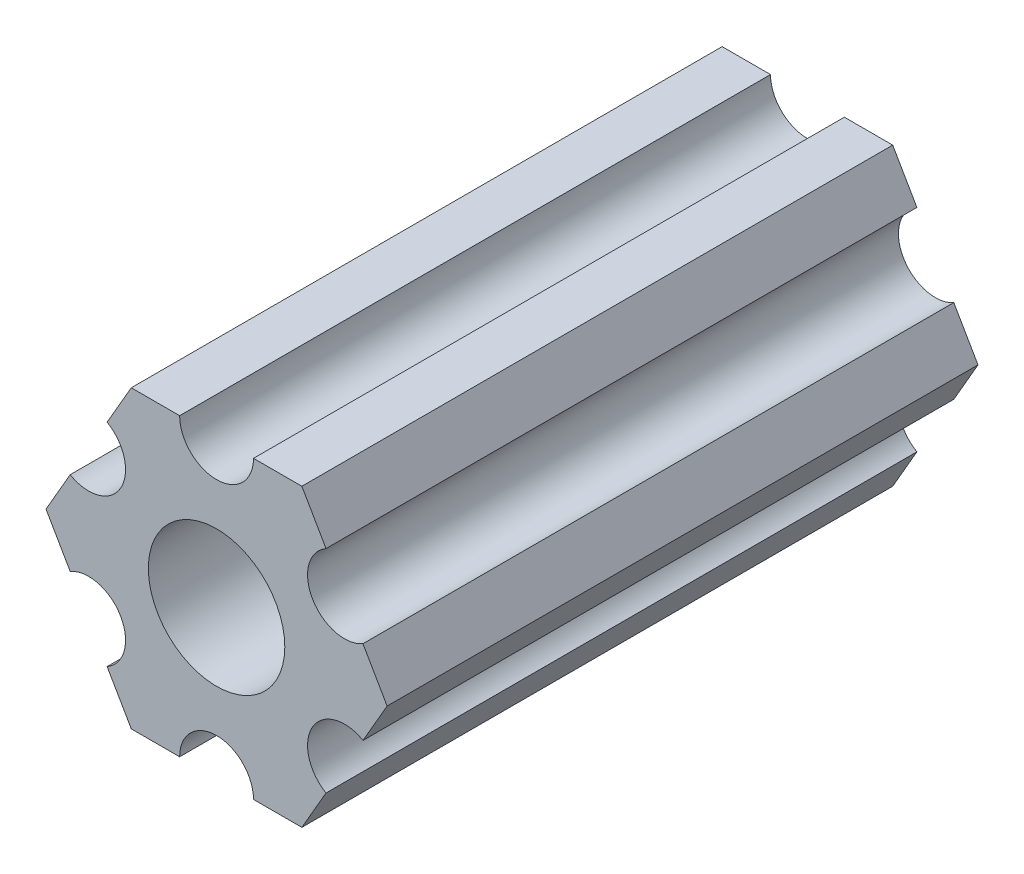
ISO-10303-21;
HEADER;
FILE_DESCRIPTION(('STEP AP214'),'2;1');
FILE_NAME('part.step','',(''),(''),'','','');
FILE_SCHEMA(('AUTOMOTIVE_DESIGN { 1 0 10303 214 1 1 1 1 }'));
ENDSEC;
DATA;
#1=APPLICATION_CONTEXT('core data for automotive mechanical design processes');
#2=APPLICATION_PROTOCOL_DEFINITION('international standard','automotive_design',2000,#1);
#3=PRODUCT_CONTEXT('',#1,'mechanical');
#4=PRODUCT('Part','Part','',(#3));
#5=PRODUCT_RELATED_PRODUCT_CATEGORY('part','',(#4));
#6=PRODUCT_DEFINITION_FORMATION('','',#4);
#7=PRODUCT_DEFINITION_CONTEXT('part definition',#1,'design');
#8=PRODUCT_DEFINITION('design','',#6,#7);
#9=PRODUCT_DEFINITION_SHAPE('','',#8);
#10=(LENGTH_UNIT() NAMED_UNIT(*) SI_UNIT(.MILLI.,.METRE.));
#11=(NAMED_UNIT(*) PLANE_ANGLE_UNIT() SI_UNIT($,.RADIAN.));
#12=(NAMED_UNIT(*) SI_UNIT($,.STERADIAN.) SOLID_ANGLE_UNIT());
#13=UNCERTAINTY_MEASURE_WITH_UNIT(LENGTH_MEASURE(1.E-05),#10,'distance_accuracy_value','');
#14=(GEOMETRIC_REPRESENTATION_CONTEXT(3) GLOBAL_UNCERTAINTY_ASSIGNED_CONTEXT((#13)) GLOBAL_UNIT_ASSIGNED_CONTEXT((#10,
#11,#12)) REPRESENTATION_CONTEXT('',''));
#15=CARTESIAN_POINT('',(0.,0.,0.));
#16=DIRECTION('',(0.,0.,1.));
#17=DIRECTION('',(1.,0.,0.));
#18=AXIS2_PLACEMENT_3D('',#15,#16,#17);
#19=CARTESIAN_POINT('',(5.49926150638083,-3.17499966684068,-25.4));
#20=DIRECTION('',(0.,0.,1.));
#21=DIRECTION('',(1.,0.,0.));
#22=AXIS2_PLACEMENT_3D('',#19,#20,#21);
#23=PLANE('',#22);
#24=CARTESIAN_POINT('',(5.49926150638083,-3.17499966684068,-25.4));
#25=DIRECTION('',(0.,0.,1.));
#26=DIRECTION('',(1.,0.,0.));
#27=AXIS2_PLACEMENT_3D('',#24,#25,#26);
#28=CIRCLE('',#27,1.58750000000001);
#29=CARTESIAN_POINT('',(6.29301142309098,-1.80018429024546,-25.4));
#30=VERTEX_POINT('',#29);
#31=CARTESIAN_POINT('',(4.70551158967068,-4.54981504343589,-25.4));
#32=VERTEX_POINT('',#31);
#33=EDGE_CURVE('E227',#30,#32,#28,.T.);
#34=ORIENTED_EDGE('',*,*,#33,.T.);
#35=DIRECTION('',(-0.499999947533953,-0.866025434075723,0.));
#36=VECTOR('',#35,1.);
#37=CARTESIAN_POINT('',(4.70551158967068,-4.54981504343589,-25.4));
#38=LINE('',#37,#36);
#39=CARTESIAN_POINT('',(3.66617452134693,-6.34999990382519,-25.4));
#40=VERTEX_POINT('',#39);
#41=EDGE_CURVE('E125',#32,#40,#38,.T.);
#42=ORIENTED_EDGE('',*,*,#41,.T.);
#43=DIRECTION('',(-1.,0.,0.));
#44=VECTOR('',#43,1.);
#45=CARTESIAN_POINT('',(3.66617452134693,-6.34999990382519,-25.4));
#46=LINE('',#45,#44);
#47=CARTESIAN_POINT('',(1.58750038469926,-6.34999990382518,-25.4));
#48=VERTEX_POINT('',#47);
#49=EDGE_CURVE('E272',#40,#48,#46,.T.);
#50=ORIENTED_EDGE('',*,*,#49,.T.);
#51=CARTESIAN_POINT('',(3.8469926204343E-07,-6.34999990382519,-25.4));
#52=DIRECTION('',(0.,0.,1.));
#53=DIRECTION('',(1.,0.,0.));
#54=AXIS2_PLACEMENT_3D('',#51,#52,#53);
#55=CIRCLE('',#54,1.5875);
#56=CARTESIAN_POINT('',(-1.58749961530074,-6.34999990382519,-25.4));
#57=VERTEX_POINT('',#56);
#58=EDGE_CURVE('E291',#48,#57,#55,.T.);
#59=ORIENTED_EDGE('',*,*,#58,.T.);
#60=DIRECTION('',(-1.,0.,0.));
#61=VECTOR('',#60,1.);
#62=CARTESIAN_POINT('',(-1.58749961530074,-6.34999990382519,-25.4));
#63=LINE('',#62,#61);
#64=CARTESIAN_POINT('',(-3.66617382465481,-6.34999990382519,-25.4));
#65=VERTEX_POINT('',#64);
#66=EDGE_CURVE('E288',#57,#65,#63,.T.);
#67=ORIENTED_EDGE('',*,*,#66,.T.);
#68=DIRECTION('',(-0.500000006198653,0.866025400205644,0.));
#69=VECTOR('',#68,1.);
#70=CARTESIAN_POINT('',(-3.66617382465481,-6.34999990382519,-25.4));
#71=LINE('',#70,#69);
#72=CARTESIAN_POINT('',(-4.70551094221689,-4.54981523977206,-25.4));
#73=VERTEX_POINT('',#72);
#74=EDGE_CURVE('E290',#65,#73,#71,.T.);
#75=ORIENTED_EDGE('',*,*,#74,.T.);
#76=CARTESIAN_POINT('',(-5.49926095205725,-3.1749999169456,-25.4));
#77=DIRECTION('',(0.,0.,1.));
#78=DIRECTION('',(1.,0.,0.));
#79=AXIS2_PLACEMENT_3D('',#76,#77,#78);
#80=CIRCLE('',#79,1.5875);
#81=CARTESIAN_POINT('',(-6.29301096189761,-1.80018459411914,-25.4));
#82=VERTEX_POINT('',#81);
#83=EDGE_CURVE('E293',#73,#82,#80,.T.);
#84=ORIENTED_EDGE('',*,*,#83,.T.);
#85=DIRECTION('',(-0.500000006198653,0.866025400205645,0.));
#86=VECTOR('',#85,1.);
#87=CARTESIAN_POINT('',(-6.29301096189761,-1.80018459411914,-25.4));
#88=LINE('',#87,#86);
#89=CARTESIAN_POINT('',(-7.33234807945963,6.99338729030344E-08,-25.4));
#90=VERTEX_POINT('',#89);
#91=EDGE_CURVE('E299',#82,#90,#88,.T.);
#92=ORIENTED_EDGE('',*,*,#91,.T.);
#93=DIRECTION('',(0.499999924400249,0.866025447431971,0.));
#94=VECTOR('',#93,1.);
#95=CARTESIAN_POINT('',(-7.33234807945963,6.99338729030344E-08,-25.4));
#96=LINE('',#95,#94);
#97=CARTESIAN_POINT('',(-6.29301121674195,1.80018468525613,-25.4));
#98=VERTEX_POINT('',#97);
#99=EDGE_CURVE('E301',#90,#98,#96,.T.);
#100=ORIENTED_EDGE('',*,*,#99,.T.);
#101=CARTESIAN_POINT('',(-5.49926133675655,3.17500008305439,-25.4));
#102=DIRECTION('',(0.,0.,1.));
#103=DIRECTION('',(1.,0.,0.));
#104=AXIS2_PLACEMENT_3D('',#101,#102,#103);
#105=CIRCLE('',#104,1.5875);
#106=CARTESIAN_POINT('',(-4.70551145677116,4.54981548085265,-25.4));
#107=VERTEX_POINT('',#106);
#108=EDGE_CURVE('E303',#98,#107,#105,.T.);
#109=ORIENTED_EDGE('',*,*,#108,.T.);
#110=DIRECTION('',(0.499999924400249,0.866025447431971,0.));
#111=VECTOR('',#110,1.);
#112=CARTESIAN_POINT('',(-4.70551145677116,4.54981548085265,-25.4));
#113=LINE('',#112,#111);
#114=CARTESIAN_POINT('',(-3.66617452134701,6.35000022210623,-25.4));
#115=VERTEX_POINT('',#114);
#116=EDGE_CURVE('E305',#107,#115,#113,.T.);
#117=ORIENTED_EDGE('',*,*,#116,.T.);
#118=DIRECTION('',(1.,0.,0.));
#119=VECTOR('',#118,1.);
#120=CARTESIAN_POINT('',(-3.66617452134701,6.35000022210623,-25.4));
#121=LINE('',#120,#119);
#122=CARTESIAN_POINT('',(-1.58750038469935,6.35000022210623,-25.4));
#123=VERTEX_POINT('',#122);
#124=EDGE_CURVE('E307',#115,#123,#121,.T.);
#125=ORIENTED_EDGE('',*,*,#124,.T.);
#126=CARTESIAN_POINT('',(-3.84699344941095E-07,6.35000022210623,-25.4));
#127=DIRECTION('',(0.,0.,1.));
#128=DIRECTION('',(1.,0.,0.));
#129=AXIS2_PLACEMENT_3D('',#126,#127,#128);
#130=CIRCLE('',#129,1.5875);
#131=CARTESIAN_POINT('',(1.58749961530066,6.35000022210623,-25.4));
#132=VERTEX_POINT('',#131);
#133=EDGE_CURVE('E309',#123,#132,#130,.T.);
#134=ORIENTED_EDGE('',*,*,#133,.T.);
#135=DIRECTION('',(1.,0.,0.));
#136=VECTOR('',#135,1.);
#137=CARTESIAN_POINT('',(1.58749961530066,6.35000022210623,-25.4));
#138=LINE('',#137,#136);
#139=CARTESIAN_POINT('',(3.66617382465472,6.35000022210622,-25.4));
#140=VERTEX_POINT('',#139);
#141=EDGE_CURVE('E311',#132,#140,#138,.T.);
#142=ORIENTED_EDGE('',*,*,#141,.T.);
#143=DIRECTION('',(0.500000052466056,-0.866025373493145,0.));
#144=VECTOR('',#143,1.);
#145=CARTESIAN_POINT('',(3.66617382465472,6.35000022210622,-25.4));
#146=LINE('',#145,#144);
#147=CARTESIAN_POINT('',(4.70551103839166,4.54981561357968,-25.4));
#148=VERTEX_POINT('',#147);
#149=EDGE_CURVE('E174',#140,#148,#146,.T.);
#150=ORIENTED_EDGE('',*,*,#149,.T.);
#151=CARTESIAN_POINT('',(5.49926112168152,3.17500033315931,-25.4));
#152=DIRECTION('',(0.,0.,1.));
#153=DIRECTION('',(1.,0.,0.));
#154=AXIS2_PLACEMENT_3D('',#151,#152,#153);
#155=CIRCLE('',#154,1.5875);
#156=CARTESIAN_POINT('',(6.29301120497139,1.80018505273895,-25.4));
#157=VERTEX_POINT('',#156);
#158=EDGE_CURVE('E168',#148,#157,#155,.T.);
#159=ORIENTED_EDGE('',*,*,#158,.T.);
#160=DIRECTION('',(0.500000052466056,-0.866025373493145,0.));
#161=VECTOR('',#160,1.);
#162=CARTESIAN_POINT('',(6.29301120497139,1.80018505273895,-25.4));
#163=LINE('',#162,#161);
#164=CARTESIAN_POINT('',(7.33234841870826,4.44212518856872E-07,-25.4));
#165=VERTEX_POINT('',#164);
#166=EDGE_CURVE('E172',#157,#165,#163,.T.);
#167=ORIENTED_EDGE('',*,*,#166,.T.);
#168=DIRECTION('',(-0.499999947533953,-0.866025434075723,0.));
#169=VECTOR('',#168,1.);
#170=CARTESIAN_POINT('',(7.33234841870826,4.44212518856872E-07,-25.4));
#171=LINE('',#170,#169);
#172=EDGE_CURVE('E52',#165,#30,#171,.T.);
#173=ORIENTED_EDGE('',*,*,#172,.T.);
#174=EDGE_LOOP('',(#34,#42,#50,#59,#67,#75,#84,#92,#100,#109,#117,#125,#134,#142,#150,#159,#167,#173));
#175=FACE_BOUND('',#174,.T.);
#176=CARTESIAN_POINT('',(0.,0.,-25.4));
#177=DIRECTION('',(0.,0.,-1.));
#178=DIRECTION('',(1.,0.,0.));
#179=AXIS2_PLACEMENT_3D('',#176,#177,#178);
#180=CIRCLE('',#179,2.9337);
#181=CARTESIAN_POINT('',(2.9337,0.,-25.4));
#182=VERTEX_POINT('',#181);
#183=EDGE_CURVE('E196',#182,#182,#180,.T.);
#184=ORIENTED_EDGE('',*,*,#183,.F.);
#185=EDGE_LOOP('',(#184));
#186=FACE_BOUND('',#185,.T.);
#187=ADVANCED_FACE('F35',(#175,#186),#23,.F.);
#188=CARTESIAN_POINT('',(5.49926150638083,-3.17499966684068,0.));
#189=DIRECTION('',(0.,0.,1.));
#190=DIRECTION('',(1.,0.,0.));
#191=AXIS2_PLACEMENT_3D('',#188,#189,#190);
#192=PLANE('',#191);
#193=CARTESIAN_POINT('',(5.49926150638083,-3.17499966684068,0.));
#194=DIRECTION('',(0.,0.,1.));
#195=DIRECTION('',(1.,0.,0.));
#196=AXIS2_PLACEMENT_3D('',#193,#194,#195);
#197=CIRCLE('',#196,1.58750000000001);
#198=CARTESIAN_POINT('',(6.29301142309098,-1.80018429024546,0.));
#199=VERTEX_POINT('',#198);
#200=CARTESIAN_POINT('',(4.70551158967068,-4.54981504343589,0.));
#201=VERTEX_POINT('',#200);
#202=EDGE_CURVE('E192',#199,#201,#197,.T.);
#203=ORIENTED_EDGE('',*,*,#202,.F.);
#204=DIRECTION('',(-0.499999947533953,-0.866025434075723,0.));
#205=VECTOR('',#204,1.);
#206=CARTESIAN_POINT('',(7.33234841870826,4.44212518856872E-07,0.));
#207=LINE('',#206,#205);
#208=CARTESIAN_POINT('',(7.33234841870826,4.44212518856872E-07,0.));
#209=VERTEX_POINT('',#208);
#210=EDGE_CURVE('E117',#209,#199,#207,.T.);
#211=ORIENTED_EDGE('',*,*,#210,.F.);
#212=DIRECTION('',(0.500000052466056,-0.866025373493145,0.));
#213=VECTOR('',#212,1.);
#214=CARTESIAN_POINT('',(6.29301120497139,1.80018505273895,0.));
#215=LINE('',#214,#213);
#216=CARTESIAN_POINT('',(6.29301120497139,1.80018505273895,0.));
#217=VERTEX_POINT('',#216);
#218=EDGE_CURVE('E111',#217,#209,#215,.T.);
#219=ORIENTED_EDGE('',*,*,#218,.F.);
#220=CARTESIAN_POINT('',(5.49926112168152,3.17500033315931,0.));
#221=DIRECTION('',(0.,0.,1.));
#222=DIRECTION('',(1.,0.,0.));
#223=AXIS2_PLACEMENT_3D('',#220,#221,#222);
#224=CIRCLE('',#223,1.5875);
#225=CARTESIAN_POINT('',(4.70551103839166,4.54981561357968,0.));
#226=VERTEX_POINT('',#225);
#227=EDGE_CURVE('E182',#226,#217,#224,.T.);
#228=ORIENTED_EDGE('',*,*,#227,.F.);
#229=DIRECTION('',(0.500000052466056,-0.866025373493145,0.));
#230=VECTOR('',#229,1.);
#231=CARTESIAN_POINT('',(3.66617382465472,6.35000022210622,0.));
#232=LINE('',#231,#230);
#233=CARTESIAN_POINT('',(3.66617382465472,6.35000022210622,0.));
#234=VERTEX_POINT('',#233);
#235=EDGE_CURVE('E222',#234,#226,#232,.T.);
#236=ORIENTED_EDGE('',*,*,#235,.F.);
#237=DIRECTION('',(1.,0.,0.));
#238=VECTOR('',#237,1.);
#239=CARTESIAN_POINT('',(1.58749961530066,6.35000022210623,0.));
#240=LINE('',#239,#238);
#241=CARTESIAN_POINT('',(1.58749961530066,6.35000022210623,0.));
#242=VERTEX_POINT('',#241);
#243=EDGE_CURVE('E220',#242,#234,#240,.T.);
#244=ORIENTED_EDGE('',*,*,#243,.F.);
#245=CARTESIAN_POINT('',(-3.84699344941095E-07,6.35000022210623,0.));
#246=DIRECTION('',(0.,0.,1.));
#247=DIRECTION('',(1.,0.,0.));
#248=AXIS2_PLACEMENT_3D('',#245,#246,#247);
#249=CIRCLE('',#248,1.5875);
#250=CARTESIAN_POINT('',(-1.58750038469935,6.35000022210623,0.));
#251=VERTEX_POINT('',#250);
#252=EDGE_CURVE('E218',#251,#242,#249,.T.);
#253=ORIENTED_EDGE('',*,*,#252,.F.);
#254=DIRECTION('',(1.,0.,0.));
#255=VECTOR('',#254,1.);
#256=CARTESIAN_POINT('',(-3.66617452134701,6.35000022210623,0.));
#257=LINE('',#256,#255);
#258=CARTESIAN_POINT('',(-3.66617452134701,6.35000022210623,0.));
#259=VERTEX_POINT('',#258);
#260=EDGE_CURVE('E216',#259,#251,#257,.T.);
#261=ORIENTED_EDGE('',*,*,#260,.F.);
#262=DIRECTION('',(0.499999924400249,0.866025447431971,0.));
#263=VECTOR('',#262,1.);
#264=CARTESIAN_POINT('',(-4.70551145677116,4.54981548085265,0.));
#265=LINE('',#264,#263);
#266=CARTESIAN_POINT('',(-4.70551145677116,4.54981548085265,0.));
#267=VERTEX_POINT('',#266);
#268=EDGE_CURVE('E214',#267,#259,#265,.T.);
#269=ORIENTED_EDGE('',*,*,#268,.F.);
#270=CARTESIAN_POINT('',(-5.49926133675655,3.17500008305439,0.));
#271=DIRECTION('',(0.,0.,1.));
#272=DIRECTION('',(1.,0.,0.));
#273=AXIS2_PLACEMENT_3D('',#270,#271,#272);
#274=CIRCLE('',#273,1.5875);
#275=CARTESIAN_POINT('',(-6.29301121674195,1.80018468525613,0.));
#276=VERTEX_POINT('',#275);
#277=EDGE_CURVE('E212',#276,#267,#274,.T.);
#278=ORIENTED_EDGE('',*,*,#277,.F.);
#279=DIRECTION('',(0.499999924400249,0.866025447431971,0.));
#280=VECTOR('',#279,1.);
#281=CARTESIAN_POINT('',(-7.33234807945963,6.99338729030344E-08,0.));
#282=LINE('',#281,#280);
#283=CARTESIAN_POINT('',(-7.33234807945963,6.99338729030344E-08,0.));
#284=VERTEX_POINT('',#283);
#285=EDGE_CURVE('E210',#284,#276,#282,.T.);
#286=ORIENTED_EDGE('',*,*,#285,.F.);
#287=DIRECTION('',(-0.500000006198653,0.866025400205645,0.));
#288=VECTOR('',#287,1.);
#289=CARTESIAN_POINT('',(-6.29301096189761,-1.80018459411914,0.));
#290=LINE('',#289,#288);
#291=CARTESIAN_POINT('',(-6.29301096189761,-1.80018459411914,0.));
#292=VERTEX_POINT('',#291);
#293=EDGE_CURVE('E208',#292,#284,#290,.T.);
#294=ORIENTED_EDGE('',*,*,#293,.F.);
#295=CARTESIAN_POINT('',(-5.49926095205725,-3.1749999169456,0.));
#296=DIRECTION('',(0.,0.,1.));
#297=DIRECTION('',(1.,0.,0.));
#298=AXIS2_PLACEMENT_3D('',#295,#296,#297);
#299=CIRCLE('',#298,1.5875);
#300=CARTESIAN_POINT('',(-4.70551094221689,-4.54981523977206,0.));
#301=VERTEX_POINT('',#300);
#302=EDGE_CURVE('E206',#301,#292,#299,.T.);
#303=ORIENTED_EDGE('',*,*,#302,.F.);
#304=DIRECTION('',(-0.500000006198653,0.866025400205644,0.));
#305=VECTOR('',#304,1.);
#306=CARTESIAN_POINT('',(-3.66617382465481,-6.34999990382519,0.));
#307=LINE('',#306,#305);
#308=CARTESIAN_POINT('',(-3.66617382465481,-6.34999990382519,0.));
#309=VERTEX_POINT('',#308);
#310=EDGE_CURVE('E204',#309,#301,#307,.T.);
#311=ORIENTED_EDGE('',*,*,#310,.F.);
#312=DIRECTION('',(-1.,0.,0.));
#313=VECTOR('',#312,1.);
#314=CARTESIAN_POINT('',(-1.58749961530074,-6.34999990382519,0.));
#315=LINE('',#314,#313);
#316=CARTESIAN_POINT('',(-1.58749961530074,-6.34999990382519,0.));
#317=VERTEX_POINT('',#316);
#318=EDGE_CURVE('E202',#317,#309,#315,.T.);
#319=ORIENTED_EDGE('',*,*,#318,.F.);
#320=CARTESIAN_POINT('',(3.8469926204343E-07,-6.34999990382519,0.));
#321=DIRECTION('',(0.,0.,1.));
#322=DIRECTION('',(1.,0.,0.));
#323=AXIS2_PLACEMENT_3D('',#320,#321,#322);
#324=CIRCLE('',#323,1.5875);
#325=CARTESIAN_POINT('',(1.58750038469926,-6.34999990382518,0.));
#326=VERTEX_POINT('',#325);
#327=EDGE_CURVE('E200',#326,#317,#324,.T.);
#328=ORIENTED_EDGE('',*,*,#327,.F.);
#329=DIRECTION('',(-1.,0.,0.));
#330=VECTOR('',#329,1.);
#331=CARTESIAN_POINT('',(3.66617452134693,-6.34999990382519,0.));
#332=LINE('',#331,#330);
#333=CARTESIAN_POINT('',(3.66617452134693,-6.34999990382519,0.));
#334=VERTEX_POINT('',#333);
#335=EDGE_CURVE('E198',#334,#326,#332,.T.);
#336=ORIENTED_EDGE('',*,*,#335,.F.);
#337=DIRECTION('',(-0.499999947533953,-0.866025434075723,0.));
#338=VECTOR('',#337,1.);
#339=CARTESIAN_POINT('',(4.70551158967068,-4.54981504343589,0.));
#340=LINE('',#339,#338);
#341=EDGE_CURVE('E195',#201,#334,#340,.T.);
#342=ORIENTED_EDGE('',*,*,#341,.F.);
#343=EDGE_LOOP('',(#203,#211,#219,#228,#236,#244,#253,#261,#269,#278,#286,#294,#303,#311,#319,
#328,#336,#342));
#344=FACE_BOUND('',#343,.T.);
#345=CARTESIAN_POINT('',(0.,0.,0.));
#346=DIRECTION('',(0.,0.,-1.));
#347=DIRECTION('',(1.,0.,0.));
#348=AXIS2_PLACEMENT_3D('',#345,#346,#347);
#349=CIRCLE('',#348,2.9337);
#350=CARTESIAN_POINT('',(2.9337,0.,0.));
#351=VERTEX_POINT('',#350);
#352=EDGE_CURVE('E536',#351,#351,#349,.T.);
#353=ORIENTED_EDGE('',*,*,#352,.T.);
#354=EDGE_LOOP('',(#353));
#355=FACE_BOUND('',#354,.T.);
#356=ADVANCED_FACE('F276',(#344,#355),#192,.T.);
#357=CARTESIAN_POINT('',(5.49926150638083,-3.17499966684068,-25.4));
#358=DIRECTION('',(0.,0.,1.));
#359=DIRECTION('',(1.,0.,0.));
#360=AXIS2_PLACEMENT_3D('',#357,#358,#359);
#361=CYLINDRICAL_SURFACE('',#360,1.58750000000001);
#362=ORIENTED_EDGE('',*,*,#202,.T.);
#363=DIRECTION('',(0.,0.,1.));
#364=VECTOR('',#363,1.);
#365=CARTESIAN_POINT('',(4.70551158967068,-4.54981504343589,-25.4));
#366=LINE('',#365,#364);
#367=EDGE_CURVE('E11',#32,#201,#366,.T.);
#368=ORIENTED_EDGE('',*,*,#367,.F.);
#369=ORIENTED_EDGE('',*,*,#33,.F.);
#370=DIRECTION('',(0.,0.,1.));
#371=VECTOR('',#370,1.);
#372=CARTESIAN_POINT('',(6.29301142309098,-1.80018429024546,-25.4));
#373=LINE('',#372,#371);
#374=EDGE_CURVE('E188',#30,#199,#373,.T.);
#375=ORIENTED_EDGE('',*,*,#374,.T.);
#376=EDGE_LOOP('',(#362,#368,#369,#375));
#377=FACE_BOUND('',#376,.T.);
#378=ADVANCED_FACE('F37',(#377),#361,.F.);
#379=CARTESIAN_POINT('',(4.70551158967068,-4.54981504343589,-25.4));
#380=DIRECTION('',(-0.866025434075723,0.499999947533953,0.));
#381=DIRECTION('',(-0.499999947533953,-0.866025434075723,0.));
#382=AXIS2_PLACEMENT_3D('',#379,#380,#381);
#383=PLANE('',#382);
#384=ORIENTED_EDGE('',*,*,#341,.T.);
#385=DIRECTION('',(0.,0.,1.));
#386=VECTOR('',#385,1.);
#387=CARTESIAN_POINT('',(3.66617452134693,-6.34999990382519,-25.4));
#388=LINE('',#387,#386);
#389=EDGE_CURVE('E44',#40,#334,#388,.T.);
#390=ORIENTED_EDGE('',*,*,#389,.F.);
#391=ORIENTED_EDGE('',*,*,#41,.F.);
#392=ORIENTED_EDGE('',*,*,#367,.T.);
#393=EDGE_LOOP('',(#384,#390,#391,#392));
#394=FACE_BOUND('',#393,.T.);
#395=ADVANCED_FACE('F345',(#394),#383,.F.);
#396=CARTESIAN_POINT('',(3.66617452134693,-6.34999990382519,-25.4));
#397=DIRECTION('',(0.,1.,0.));
#398=DIRECTION('',(-1.,0.,0.));
#399=AXIS2_PLACEMENT_3D('',#396,#397,#398);
#400=PLANE('',#399);
#401=ORIENTED_EDGE('',*,*,#335,.T.);
#402=DIRECTION('',(0.,0.,1.));
#403=VECTOR('',#402,1.);
#404=CARTESIAN_POINT('',(1.58750038469926,-6.34999990382518,-25.4));
#405=LINE('',#404,#403);
#406=EDGE_CURVE('E264',#48,#326,#405,.T.);
#407=ORIENTED_EDGE('',*,*,#406,.F.);
#408=ORIENTED_EDGE('',*,*,#49,.F.);
#409=ORIENTED_EDGE('',*,*,#389,.T.);
#410=EDGE_LOOP('',(#401,#407,#408,#409));
#411=FACE_BOUND('',#410,.T.);
#412=ADVANCED_FACE('F270',(#411),#400,.F.);
#413=CARTESIAN_POINT('',(3.8469926204343E-07,-6.34999990382519,-25.4));
#414=DIRECTION('',(0.,0.,1.));
#415=DIRECTION('',(1.,0.,0.));
#416=AXIS2_PLACEMENT_3D('',#413,#414,#415);
#417=CYLINDRICAL_SURFACE('',#416,1.5875);
#418=ORIENTED_EDGE('',*,*,#327,.T.);
#419=DIRECTION('',(0.,0.,1.));
#420=VECTOR('',#419,1.);
#421=CARTESIAN_POINT('',(-1.58749961530074,-6.34999990382519,-25.4));
#422=LINE('',#421,#420);
#423=EDGE_CURVE('E261',#57,#317,#422,.T.);
#424=ORIENTED_EDGE('',*,*,#423,.F.);
#425=ORIENTED_EDGE('',*,*,#58,.F.);
#426=ORIENTED_EDGE('',*,*,#406,.T.);
#427=EDGE_LOOP('',(#418,#424,#425,#426));
#428=FACE_BOUND('',#427,.T.);
#429=ADVANCED_FACE('F282',(#428),#417,.F.);
#430=CARTESIAN_POINT('',(-1.58749961530074,-6.34999990382519,-25.4));
#431=DIRECTION('',(0.,1.,0.));
#432=DIRECTION('',(-1.,0.,0.));
#433=AXIS2_PLACEMENT_3D('',#430,#431,#432);
#434=PLANE('',#433);
#435=ORIENTED_EDGE('',*,*,#318,.T.);
#436=DIRECTION('',(0.,0.,1.));
#437=VECTOR('',#436,1.);
#438=CARTESIAN_POINT('',(-3.66617382465481,-6.34999990382519,-25.4));
#439=LINE('',#438,#437);
#440=EDGE_CURVE('E258',#65,#309,#439,.T.);
#441=ORIENTED_EDGE('',*,*,#440,.F.);
#442=ORIENTED_EDGE('',*,*,#66,.F.);
#443=ORIENTED_EDGE('',*,*,#423,.T.);
#444=EDGE_LOOP('',(#435,#441,#442,#443));
#445=FACE_BOUND('',#444,.T.);
#446=ADVANCED_FACE('F286',(#445),#434,.F.);
#447=CARTESIAN_POINT('',(-3.66617382465481,-6.34999990382519,-25.4));
#448=DIRECTION('',(0.866025400205644,0.500000006198653,0.));
#449=DIRECTION('',(-0.500000006198653,0.866025400205645,0.));
#450=AXIS2_PLACEMENT_3D('',#447,#448,#449);
#451=PLANE('',#450);
#452=ORIENTED_EDGE('',*,*,#310,.T.);
#453=DIRECTION('',(0.,0.,1.));
#454=VECTOR('',#453,1.);
#455=CARTESIAN_POINT('',(-4.70551094221689,-4.54981523977206,-25.4));
#456=LINE('',#455,#454);
#457=EDGE_CURVE('E255',#73,#301,#456,.T.);
#458=ORIENTED_EDGE('',*,*,#457,.F.);
#459=ORIENTED_EDGE('',*,*,#74,.F.);
#460=ORIENTED_EDGE('',*,*,#440,.T.);
#461=EDGE_LOOP('',(#452,#458,#459,#460));
#462=FACE_BOUND('',#461,.T.);
#463=ADVANCED_FACE('F358',(#462),#451,.F.);
#464=CARTESIAN_POINT('',(-5.49926095205725,-3.1749999169456,-25.4));
#465=DIRECTION('',(0.,0.,1.));
#466=DIRECTION('',(1.,0.,0.));
#467=AXIS2_PLACEMENT_3D('',#464,#465,#466);
#468=CYLINDRICAL_SURFACE('',#467,1.5875);
#469=ORIENTED_EDGE('',*,*,#302,.T.);
#470=DIRECTION('',(0.,0.,1.));
#471=VECTOR('',#470,1.);
#472=CARTESIAN_POINT('',(-6.29301096189761,-1.80018459411914,-25.4));
#473=LINE('',#472,#471);
#474=EDGE_CURVE('E252',#82,#292,#473,.T.);
#475=ORIENTED_EDGE('',*,*,#474,.F.);
#476=ORIENTED_EDGE('',*,*,#83,.F.);
#477=ORIENTED_EDGE('',*,*,#457,.T.);
#478=EDGE_LOOP('',(#469,#475,#476,#477));
#479=FACE_BOUND('',#478,.T.);
#480=ADVANCED_FACE('F361',(#479),#468,.F.);
#481=CARTESIAN_POINT('',(-6.29301096189761,-1.80018459411914,-25.4));
#482=DIRECTION('',(0.866025400205645,0.500000006198653,0.));
#483=DIRECTION('',(-0.500000006198653,0.866025400205645,0.));
#484=AXIS2_PLACEMENT_3D('',#481,#482,#483);
#485=PLANE('',#484);
#486=ORIENTED_EDGE('',*,*,#293,.T.);
#487=DIRECTION('',(0.,0.,1.));
#488=VECTOR('',#487,1.);
#489=CARTESIAN_POINT('',(-7.33234807945963,6.99338729030344E-08,-25.4));
#490=LINE('',#489,#488);
#491=EDGE_CURVE('E249',#90,#284,#490,.T.);
#492=ORIENTED_EDGE('',*,*,#491,.F.);
#493=ORIENTED_EDGE('',*,*,#91,.F.);
#494=ORIENTED_EDGE('',*,*,#474,.T.);
#495=EDGE_LOOP('',(#486,#492,#493,#494));
#496=FACE_BOUND('',#495,.T.);
#497=ADVANCED_FACE('F365',(#496),#485,.F.);
#498=CARTESIAN_POINT('',(-7.33234807945963,6.99338729030344E-08,-25.4));
#499=DIRECTION('',(0.866025447431971,-0.499999924400249,0.));
#500=DIRECTION('',(0.499999924400249,0.866025447431971,0.));
#501=AXIS2_PLACEMENT_3D('',#498,#499,#500);
#502=PLANE('',#501);
#503=ORIENTED_EDGE('',*,*,#285,.T.);
#504=DIRECTION('',(0.,0.,1.));
#505=VECTOR('',#504,1.);
#506=CARTESIAN_POINT('',(-6.29301121674195,1.80018468525613,-25.4));
#507=LINE('',#506,#505);
#508=EDGE_CURVE('E246',#98,#276,#507,.T.);
#509=ORIENTED_EDGE('',*,*,#508,.F.);
#510=ORIENTED_EDGE('',*,*,#99,.F.);
#511=ORIENTED_EDGE('',*,*,#491,.T.);
#512=EDGE_LOOP('',(#503,#509,#510,#511));
#513=FACE_BOUND('',#512,.T.);
#514=ADVANCED_FACE('F369',(#513),#502,.F.);
#515=CARTESIAN_POINT('',(-5.49926133675655,3.17500008305439,-25.4));
#516=DIRECTION('',(0.,0.,1.));
#517=DIRECTION('',(1.,0.,0.));
#518=AXIS2_PLACEMENT_3D('',#515,#516,#517);
#519=CYLINDRICAL_SURFACE('',#518,1.5875);
#520=ORIENTED_EDGE('',*,*,#277,.T.);
#521=DIRECTION('',(0.,0.,1.));
#522=VECTOR('',#521,1.);
#523=CARTESIAN_POINT('',(-4.70551145677116,4.54981548085265,-25.4));
#524=LINE('',#523,#522);
#525=EDGE_CURVE('E243',#107,#267,#524,.T.);
#526=ORIENTED_EDGE('',*,*,#525,.F.);
#527=ORIENTED_EDGE('',*,*,#108,.F.);
#528=ORIENTED_EDGE('',*,*,#508,.T.);
#529=EDGE_LOOP('',(#520,#526,#527,#528));
#530=FACE_BOUND('',#529,.T.);
#531=ADVANCED_FACE('F373',(#530),#519,.F.);
#532=CARTESIAN_POINT('',(-4.70551145677116,4.54981548085265,-25.4));
#533=DIRECTION('',(0.866025447431971,-0.499999924400249,0.));
#534=DIRECTION('',(0.499999924400249,0.866025447431971,0.));
#535=AXIS2_PLACEMENT_3D('',#532,#533,#534);
#536=PLANE('',#535);
#537=ORIENTED_EDGE('',*,*,#268,.T.);
#538=DIRECTION('',(0.,0.,1.));
#539=VECTOR('',#538,1.);
#540=CARTESIAN_POINT('',(-3.66617452134701,6.35000022210623,-25.4));
#541=LINE('',#540,#539);
#542=EDGE_CURVE('E240',#115,#259,#541,.T.);
#543=ORIENTED_EDGE('',*,*,#542,.F.);
#544=ORIENTED_EDGE('',*,*,#116,.F.);
#545=ORIENTED_EDGE('',*,*,#525,.T.);
#546=EDGE_LOOP('',(#537,#543,#544,#545));
#547=FACE_BOUND('',#546,.T.);
#548=ADVANCED_FACE('F377',(#547),#536,.F.);
#549=CARTESIAN_POINT('',(-3.66617452134701,6.35000022210623,-25.4));
#550=DIRECTION('',(0.,-1.,0.));
#551=DIRECTION('',(0.,0.,-1.));
#552=AXIS2_PLACEMENT_3D('',#549,#550,#551);
#553=PLANE('',#552);
#554=ORIENTED_EDGE('',*,*,#260,.T.);
#555=DIRECTION('',(0.,0.,1.));
#556=VECTOR('',#555,1.);
#557=CARTESIAN_POINT('',(-1.58750038469935,6.35000022210623,-25.4));
#558=LINE('',#557,#556);
#559=EDGE_CURVE('E237',#123,#251,#558,.T.);
#560=ORIENTED_EDGE('',*,*,#559,.F.);
#561=ORIENTED_EDGE('',*,*,#124,.F.);
#562=ORIENTED_EDGE('',*,*,#542,.T.);
#563=EDGE_LOOP('',(#554,#560,#561,#562));
#564=FACE_BOUND('',#563,.T.);
#565=ADVANCED_FACE('F381',(#564),#553,.F.);
#566=CARTESIAN_POINT('',(-3.84699344941095E-07,6.35000022210623,-25.4));
#567=DIRECTION('',(0.,0.,1.));
#568=DIRECTION('',(1.,0.,0.));
#569=AXIS2_PLACEMENT_3D('',#566,#567,#568);
#570=CYLINDRICAL_SURFACE('',#569,1.5875);
#571=ORIENTED_EDGE('',*,*,#252,.T.);
#572=DIRECTION('',(0.,0.,1.));
#573=VECTOR('',#572,1.);
#574=CARTESIAN_POINT('',(1.58749961530066,6.35000022210623,-25.4));
#575=LINE('',#574,#573);
#576=EDGE_CURVE('E234',#132,#242,#575,.T.);
#577=ORIENTED_EDGE('',*,*,#576,.F.);
#578=ORIENTED_EDGE('',*,*,#133,.F.);
#579=ORIENTED_EDGE('',*,*,#559,.T.);
#580=EDGE_LOOP('',(#571,#577,#578,#579));
#581=FACE_BOUND('',#580,.T.);
#582=ADVANCED_FACE('F385',(#581),#570,.F.);
#583=CARTESIAN_POINT('',(1.58749961530066,6.35000022210623,-25.4));
#584=DIRECTION('',(0.,-1.,0.));
#585=DIRECTION('',(1.,0.,0.));
#586=AXIS2_PLACEMENT_3D('',#583,#584,#585);
#587=PLANE('',#586);
#588=ORIENTED_EDGE('',*,*,#243,.T.);
#589=DIRECTION('',(0.,0.,1.));
#590=VECTOR('',#589,1.);
#591=CARTESIAN_POINT('',(3.66617382465472,6.35000022210622,-25.4));
#592=LINE('',#591,#590);
#593=EDGE_CURVE('E231',#140,#234,#592,.T.);
#594=ORIENTED_EDGE('',*,*,#593,.F.);
#595=ORIENTED_EDGE('',*,*,#141,.F.);
#596=ORIENTED_EDGE('',*,*,#576,.T.);
#597=EDGE_LOOP('',(#588,#594,#595,#596));
#598=FACE_BOUND('',#597,.T.);
#599=ADVANCED_FACE('F317',(#598),#587,.F.);
#600=CARTESIAN_POINT('',(3.66617382465472,6.35000022210622,-25.4));
#601=DIRECTION('',(-0.866025373493145,-0.500000052466056,0.));
#602=DIRECTION('',(0.500000052466056,-0.866025373493145,0.));
#603=AXIS2_PLACEMENT_3D('',#600,#601,#602);
#604=PLANE('',#603);
#605=ORIENTED_EDGE('',*,*,#235,.T.);
#606=DIRECTION('',(0.,0.,1.));
#607=VECTOR('',#606,1.);
#608=CARTESIAN_POINT('',(4.70551103839166,4.54981561357968,-25.4));
#609=LINE('',#608,#607);
#610=EDGE_CURVE('E183',#148,#226,#609,.T.);
#611=ORIENTED_EDGE('',*,*,#610,.F.);
#612=ORIENTED_EDGE('',*,*,#149,.F.);
#613=ORIENTED_EDGE('',*,*,#593,.T.);
#614=EDGE_LOOP('',(#605,#611,#612,#613));
#615=FACE_BOUND('',#614,.T.);
#616=ADVANCED_FACE('F321',(#615),#604,.F.);
#617=CARTESIAN_POINT('',(5.49926112168152,3.17500033315931,-25.4));
#618=DIRECTION('',(0.,0.,1.));
#619=DIRECTION('',(1.,0.,0.));
#620=AXIS2_PLACEMENT_3D('',#617,#618,#619);
#621=CYLINDRICAL_SURFACE('',#620,1.5875);
#622=ORIENTED_EDGE('',*,*,#227,.T.);
#623=DIRECTION('',(0.,0.,1.));
#624=VECTOR('',#623,1.);
#625=CARTESIAN_POINT('',(6.29301120497139,1.80018505273895,-25.4));
#626=LINE('',#625,#624);
#627=EDGE_CURVE('E179',#157,#217,#626,.T.);
#628=ORIENTED_EDGE('',*,*,#627,.F.);
#629=ORIENTED_EDGE('',*,*,#158,.F.);
#630=ORIENTED_EDGE('',*,*,#610,.T.);
#631=EDGE_LOOP('',(#622,#628,#629,#630));
#632=FACE_BOUND('',#631,.T.);
#633=ADVANCED_FACE('F180',(#632),#621,.F.);
#634=CARTESIAN_POINT('',(6.29301120497139,1.80018505273895,-25.4));
#635=DIRECTION('',(-0.866025373493145,-0.500000052466056,0.));
#636=DIRECTION('',(0.500000052466056,-0.866025373493145,0.));
#637=AXIS2_PLACEMENT_3D('',#634,#635,#636);
#638=PLANE('',#637);
#639=ORIENTED_EDGE('',*,*,#218,.T.);
#640=DIRECTION('',(0.,0.,1.));
#641=VECTOR('',#640,1.);
#642=CARTESIAN_POINT('',(7.33234841870826,4.44212518856872E-07,-25.4));
#643=LINE('',#642,#641);
#644=EDGE_CURVE('E184',#165,#209,#643,.T.);
#645=ORIENTED_EDGE('',*,*,#644,.F.);
#646=ORIENTED_EDGE('',*,*,#166,.F.);
#647=ORIENTED_EDGE('',*,*,#627,.T.);
#648=EDGE_LOOP('',(#639,#645,#646,#647));
#649=FACE_BOUND('',#648,.T.);
#650=ADVANCED_FACE('F186',(#649),#638,.F.);
#651=CARTESIAN_POINT('',(7.33234841870826,4.44212518856872E-07,-25.4));
#652=DIRECTION('',(-0.866025434075723,0.499999947533953,0.));
#653=DIRECTION('',(-0.499999947533953,-0.866025434075723,0.));
#654=AXIS2_PLACEMENT_3D('',#651,#652,#653);
#655=PLANE('',#654);
#656=ORIENTED_EDGE('',*,*,#210,.T.);
#657=ORIENTED_EDGE('',*,*,#374,.F.);
#658=ORIENTED_EDGE('',*,*,#172,.F.);
#659=ORIENTED_EDGE('',*,*,#644,.T.);
#660=EDGE_LOOP('',(#656,#657,#658,#659));
#661=FACE_BOUND('',#660,.T.);
#662=ADVANCED_FACE('F325',(#661),#655,.F.);
#663=CARTESIAN_POINT('',(0.,0.,-25.4));
#664=DIRECTION('',(0.,0.,1.));
#665=DIRECTION('',(1.,0.,0.));
#666=AXIS2_PLACEMENT_3D('',#663,#664,#665);
#667=CYLINDRICAL_SURFACE('',#666,2.9337);
#668=ORIENTED_EDGE('',*,*,#183,.T.);
#669=EDGE_LOOP('',(#668));
#670=FACE_BOUND('',#669,.T.);
#671=ORIENTED_EDGE('',*,*,#352,.F.);
#672=EDGE_LOOP('',(#671));
#673=FACE_BOUND('',#672,.T.);
#674=ADVANCED_FACE('F327',(#670,#673),#667,.F.);
#675=CLOSED_SHELL('',(#187,#356,#378,#395,#412,#429,#446,#463,#480,#497,#514,#531,#548,#565,
#582,#599,#616,#633,#650,#662,#674));
#676=MANIFOLD_SOLID_BREP('B2',#675);
#677=ADVANCED_BREP_SHAPE_REPRESENTATION('',(#18,#676),#14);
#678=SHAPE_DEFINITION_REPRESENTATION(#9,#677);
ENDSEC;
END-ISO-10303-21;
